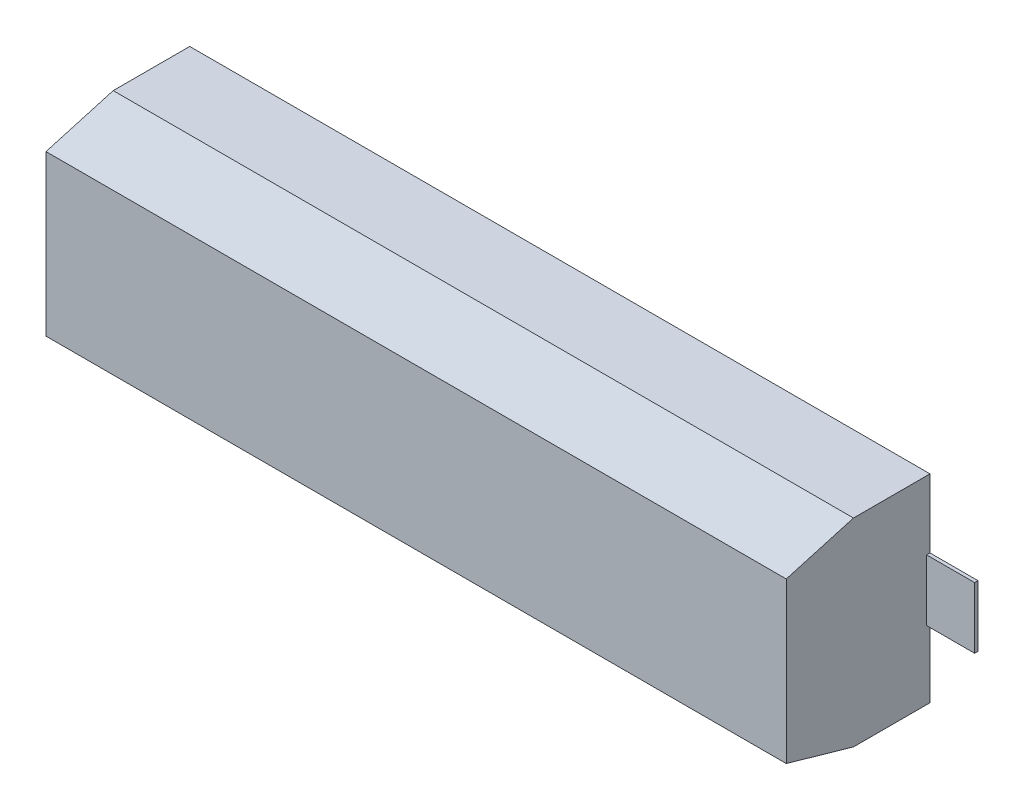
ISO-10303-21;
HEADER;
FILE_DESCRIPTION(('STEP AP214'),'2;1');
FILE_NAME('part.step','',(''),(''),'','','');
FILE_SCHEMA(('AUTOMOTIVE_DESIGN { 1 0 10303 214 1 1 1 1 }'));
ENDSEC;
DATA;
#1=APPLICATION_CONTEXT('core data for automotive mechanical design processes');
#2=APPLICATION_PROTOCOL_DEFINITION('international standard','automotive_design',2000,#1);
#3=PRODUCT_CONTEXT('',#1,'mechanical');
#4=PRODUCT('Part','Part','',(#3));
#5=PRODUCT_RELATED_PRODUCT_CATEGORY('part','',(#4));
#6=PRODUCT_DEFINITION_FORMATION('','',#4);
#7=PRODUCT_DEFINITION_CONTEXT('part definition',#1,'design');
#8=PRODUCT_DEFINITION('design','',#6,#7);
#9=PRODUCT_DEFINITION_SHAPE('','',#8);
#10=(LENGTH_UNIT() NAMED_UNIT(*) SI_UNIT(.MILLI.,.METRE.));
#11=(NAMED_UNIT(*) PLANE_ANGLE_UNIT() SI_UNIT($,.RADIAN.));
#12=(NAMED_UNIT(*) SI_UNIT($,.STERADIAN.) SOLID_ANGLE_UNIT());
#13=UNCERTAINTY_MEASURE_WITH_UNIT(LENGTH_MEASURE(1.E-05),#10,'distance_accuracy_value','');
#14=(GEOMETRIC_REPRESENTATION_CONTEXT(3) GLOBAL_UNCERTAINTY_ASSIGNED_CONTEXT((#13)) GLOBAL_UNIT_ASSIGNED_CONTEXT((#10,
#11,#12)) REPRESENTATION_CONTEXT('',''));
#15=CARTESIAN_POINT('',(0.,0.,0.));
#16=DIRECTION('',(0.,0.,1.));
#17=DIRECTION('',(1.,0.,0.));
#18=AXIS2_PLACEMENT_3D('',#15,#16,#17);
#19=CARTESIAN_POINT('',(38.555,10.325,14.97));
#20=DIRECTION('',(-1.,0.,0.));
#21=DIRECTION('',(0.,-1.,0.));
#22=AXIS2_PLACEMENT_3D('',#19,#20,#21);
#23=PLANE('',#22);
#24=DIRECTION('',(0.,0.,-1.));
#25=VECTOR('',#24,1.);
#26=CARTESIAN_POINT('',(38.555,-3.19,0.35));
#27=LINE('',#26,#25);
#28=CARTESIAN_POINT('',(38.555,-3.19,0.35));
#29=VERTEX_POINT('',#28);
#30=CARTESIAN_POINT('',(38.555,-3.19,0.));
#31=VERTEX_POINT('',#30);
#32=EDGE_CURVE('E170',#29,#31,#27,.T.);
#33=ORIENTED_EDGE('',*,*,#32,.F.);
#34=DIRECTION('',(0.,1.,0.));
#35=VECTOR('',#34,1.);
#36=CARTESIAN_POINT('',(38.555,3.19,0.35));
#37=LINE('',#36,#35);
#38=CARTESIAN_POINT('',(38.555,3.19,0.35));
#39=VERTEX_POINT('',#38);
#40=EDGE_CURVE('E162',#29,#39,#37,.T.);
#41=ORIENTED_EDGE('',*,*,#40,.T.);
#42=DIRECTION('',(0.,0.,-1.));
#43=VECTOR('',#42,1.);
#44=CARTESIAN_POINT('',(38.555,3.19,0.35));
#45=LINE('',#44,#43);
#46=CARTESIAN_POINT('',(38.555,3.19,0.));
#47=VERTEX_POINT('',#46);
#48=EDGE_CURVE('E147',#39,#47,#45,.T.);
#49=ORIENTED_EDGE('',*,*,#48,.T.);
#50=DIRECTION('',(0.,1.,0.));
#51=VECTOR('',#50,1.);
#52=CARTESIAN_POINT('',(38.555,10.325,0.));
#53=LINE('',#52,#51);
#54=CARTESIAN_POINT('',(38.555,10.325,0.));
#55=VERTEX_POINT('',#54);
#56=EDGE_CURVE('E190',#47,#55,#53,.T.);
#57=ORIENTED_EDGE('',*,*,#56,.T.);
#58=DIRECTION('',(0.,0.,-1.));
#59=VECTOR('',#58,1.);
#60=CARTESIAN_POINT('',(38.555,10.325,14.97));
#61=LINE('',#60,#59);
#62=CARTESIAN_POINT('',(38.555,10.325,7.96999999999994));
#63=VERTEX_POINT('',#62);
#64=EDGE_CURVE('E268',#63,#55,#61,.T.);
#65=ORIENTED_EDGE('',*,*,#64,.F.);
#66=DIRECTION('',(0.,-0.274721127897375,0.961523947640824));
#67=VECTOR('',#66,1.);
#68=CARTESIAN_POINT('',(38.555,8.32499999999999,14.97));
#69=LINE('',#68,#67);
#70=CARTESIAN_POINT('',(38.555,8.325,14.97));
#71=VERTEX_POINT('',#70);
#72=EDGE_CURVE('E280',#63,#71,#69,.T.);
#73=ORIENTED_EDGE('',*,*,#72,.T.);
#74=DIRECTION('',(0.,1.,0.));
#75=VECTOR('',#74,1.);
#76=CARTESIAN_POINT('',(38.555,10.325,14.97));
#77=LINE('',#76,#75);
#78=CARTESIAN_POINT('',(38.555,-8.32500000000001,14.97));
#79=VERTEX_POINT('',#78);
#80=EDGE_CURVE('E234',#79,#71,#77,.T.);
#81=ORIENTED_EDGE('',*,*,#80,.F.);
#82=DIRECTION('',(0.,-0.274721127897375,-0.961523947640824));
#83=VECTOR('',#82,1.);
#84=CARTESIAN_POINT('',(38.555,-8.32500000000001,14.97));
#85=LINE('',#84,#83);
#86=CARTESIAN_POINT('',(38.555,-10.325,7.96999999999994));
#87=VERTEX_POINT('',#86);
#88=EDGE_CURVE('E283',#79,#87,#85,.T.);
#89=ORIENTED_EDGE('',*,*,#88,.T.);
#90=DIRECTION('',(0.,0.,-1.));
#91=VECTOR('',#90,1.);
#92=CARTESIAN_POINT('',(38.555,-10.325,14.97));
#93=LINE('',#92,#91);
#94=CARTESIAN_POINT('',(38.555,-10.325,0.));
#95=VERTEX_POINT('',#94);
#96=EDGE_CURVE('E243',#87,#95,#93,.T.);
#97=ORIENTED_EDGE('',*,*,#96,.T.);
#98=EDGE_CURVE('E244',#95,#31,#53,.T.);
#99=ORIENTED_EDGE('',*,*,#98,.T.);
#100=EDGE_LOOP('',(#33,#41,#49,#57,#65,#73,#81,#89,#97,#99));
#101=FACE_BOUND('',#100,.T.);
#102=ADVANCED_FACE('F47',(#101),#23,.F.);
#103=CARTESIAN_POINT('',(-38.555,10.325,14.97));
#104=DIRECTION('',(1.,0.,0.));
#105=DIRECTION('',(0.,0.,-1.));
#106=AXIS2_PLACEMENT_3D('',#103,#104,#105);
#107=PLANE('',#106);
#108=DIRECTION('',(0.,0.,-1.));
#109=VECTOR('',#108,1.);
#110=CARTESIAN_POINT('',(-38.555,3.19,0.35));
#111=LINE('',#110,#109);
#112=CARTESIAN_POINT('',(-38.555,3.19,0.35));
#113=VERTEX_POINT('',#112);
#114=CARTESIAN_POINT('',(-38.555,3.19,0.));
#115=VERTEX_POINT('',#114);
#116=EDGE_CURVE('E206',#113,#115,#111,.T.);
#117=ORIENTED_EDGE('',*,*,#116,.F.);
#118=DIRECTION('',(0.,-1.,0.));
#119=VECTOR('',#118,1.);
#120=CARTESIAN_POINT('',(-38.555,3.19,0.35));
#121=LINE('',#120,#119);
#122=CARTESIAN_POINT('',(-38.555,-3.19,0.35));
#123=VERTEX_POINT('',#122);
#124=EDGE_CURVE('E214',#113,#123,#121,.T.);
#125=ORIENTED_EDGE('',*,*,#124,.T.);
#126=DIRECTION('',(0.,0.,-1.));
#127=VECTOR('',#126,1.);
#128=CARTESIAN_POINT('',(-38.555,-3.19,0.35));
#129=LINE('',#128,#127);
#130=CARTESIAN_POINT('',(-38.555,-3.19,0.));
#131=VERTEX_POINT('',#130);
#132=EDGE_CURVE('E196',#123,#131,#129,.T.);
#133=ORIENTED_EDGE('',*,*,#132,.T.);
#134=DIRECTION('',(0.,-1.,0.));
#135=VECTOR('',#134,1.);
#136=CARTESIAN_POINT('',(-38.555,10.325,0.));
#137=LINE('',#136,#135);
#138=CARTESIAN_POINT('',(-38.555,-10.325,0.));
#139=VERTEX_POINT('',#138);
#140=EDGE_CURVE('E251',#131,#139,#137,.T.);
#141=ORIENTED_EDGE('',*,*,#140,.T.);
#142=DIRECTION('',(0.,0.,-1.));
#143=VECTOR('',#142,1.);
#144=CARTESIAN_POINT('',(-38.555,-10.325,14.97));
#145=LINE('',#144,#143);
#146=CARTESIAN_POINT('',(-38.555,-10.325,7.96999999999994));
#147=VERTEX_POINT('',#146);
#148=EDGE_CURVE('E261',#147,#139,#145,.T.);
#149=ORIENTED_EDGE('',*,*,#148,.F.);
#150=DIRECTION('',(0.,0.274721127897375,0.961523947640824));
#151=VECTOR('',#150,1.);
#152=CARTESIAN_POINT('',(-38.555,-8.32500000000001,14.97));
#153=LINE('',#152,#151);
#154=CARTESIAN_POINT('',(-38.555,-8.32500000000001,14.97));
#155=VERTEX_POINT('',#154);
#156=EDGE_CURVE('E57',#147,#155,#153,.T.);
#157=ORIENTED_EDGE('',*,*,#156,.T.);
#158=DIRECTION('',(0.,-1.,0.));
#159=VECTOR('',#158,1.);
#160=CARTESIAN_POINT('',(-38.555,10.325,14.97));
#161=LINE('',#160,#159);
#162=CARTESIAN_POINT('',(-38.555,8.325,14.97));
#163=VERTEX_POINT('',#162);
#164=EDGE_CURVE('E238',#163,#155,#161,.T.);
#165=ORIENTED_EDGE('',*,*,#164,.F.);
#166=DIRECTION('',(0.,0.274721127897375,-0.961523947640824));
#167=VECTOR('',#166,1.);
#168=CARTESIAN_POINT('',(-38.555,8.325,14.97));
#169=LINE('',#168,#167);
#170=CARTESIAN_POINT('',(-38.555,10.325,7.96999999999994));
#171=VERTEX_POINT('',#170);
#172=EDGE_CURVE('E289',#163,#171,#169,.T.);
#173=ORIENTED_EDGE('',*,*,#172,.T.);
#174=DIRECTION('',(0.,0.,-1.));
#175=VECTOR('',#174,1.);
#176=CARTESIAN_POINT('',(-38.555,10.325,14.97));
#177=LINE('',#176,#175);
#178=CARTESIAN_POINT('',(-38.555,10.325,0.));
#179=VERTEX_POINT('',#178);
#180=EDGE_CURVE('E265',#171,#179,#177,.T.);
#181=ORIENTED_EDGE('',*,*,#180,.T.);
#182=EDGE_CURVE('E252',#179,#115,#137,.T.);
#183=ORIENTED_EDGE('',*,*,#182,.T.);
#184=EDGE_LOOP('',(#117,#125,#133,#141,#149,#157,#165,#173,#181,#183));
#185=FACE_BOUND('',#184,.T.);
#186=ADVANCED_FACE('F297',(#185),#107,.F.);
#187=CARTESIAN_POINT('',(-38.555,10.325,14.97));
#188=DIRECTION('',(0.,-1.,0.));
#189=DIRECTION('',(0.,0.,-1.));
#190=AXIS2_PLACEMENT_3D('',#187,#188,#189);
#191=PLANE('',#190);
#192=ORIENTED_EDGE('',*,*,#180,.F.);
#193=DIRECTION('',(1.,0.,0.));
#194=VECTOR('',#193,1.);
#195=CARTESIAN_POINT('',(38.555,10.325,7.96999999999994));
#196=LINE('',#195,#194);
#197=EDGE_CURVE('E11',#171,#63,#196,.T.);
#198=ORIENTED_EDGE('',*,*,#197,.T.);
#199=ORIENTED_EDGE('',*,*,#64,.T.);
#200=DIRECTION('',(-1.,0.,0.));
#201=VECTOR('',#200,1.);
#202=CARTESIAN_POINT('',(-38.555,10.325,0.));
#203=LINE('',#202,#201);
#204=EDGE_CURVE('E247',#55,#179,#203,.T.);
#205=ORIENTED_EDGE('',*,*,#204,.T.);
#206=EDGE_LOOP('',(#192,#198,#199,#205));
#207=FACE_BOUND('',#206,.T.);
#208=ADVANCED_FACE('F334',(#207),#191,.F.);
#209=CARTESIAN_POINT('',(-38.555,-10.325,14.97));
#210=DIRECTION('',(0.,1.,0.));
#211=DIRECTION('',(0.,0.,1.));
#212=AXIS2_PLACEMENT_3D('',#209,#210,#211);
#213=PLANE('',#212);
#214=ORIENTED_EDGE('',*,*,#96,.F.);
#215=DIRECTION('',(-1.,0.,0.));
#216=VECTOR('',#215,1.);
#217=CARTESIAN_POINT('',(-38.555,-10.325,7.96999999999994));
#218=LINE('',#217,#216);
#219=EDGE_CURVE('E286',#87,#147,#218,.T.);
#220=ORIENTED_EDGE('',*,*,#219,.T.);
#221=ORIENTED_EDGE('',*,*,#148,.T.);
#222=DIRECTION('',(1.,0.,0.));
#223=VECTOR('',#222,1.);
#224=CARTESIAN_POINT('',(-38.555,-10.325,0.));
#225=LINE('',#224,#223);
#226=EDGE_CURVE('E239',#139,#95,#225,.T.);
#227=ORIENTED_EDGE('',*,*,#226,.T.);
#228=EDGE_LOOP('',(#214,#220,#221,#227));
#229=FACE_BOUND('',#228,.T.);
#230=ADVANCED_FACE('F308',(#229),#213,.F.);
#231=CARTESIAN_POINT('',(0.,0.,14.97));
#232=DIRECTION('',(0.,0.,1.));
#233=DIRECTION('',(1.,0.,0.));
#234=AXIS2_PLACEMENT_3D('',#231,#232,#233);
#235=PLANE('',#234);
#236=ORIENTED_EDGE('',*,*,#164,.T.);
#237=DIRECTION('',(1.,0.,0.));
#238=VECTOR('',#237,1.);
#239=CARTESIAN_POINT('',(38.555,-8.32500000000001,14.97));
#240=LINE('',#239,#238);
#241=EDGE_CURVE('E276',#155,#79,#240,.T.);
#242=ORIENTED_EDGE('',*,*,#241,.T.);
#243=ORIENTED_EDGE('',*,*,#80,.T.);
#244=DIRECTION('',(-1.,0.,0.));
#245=VECTOR('',#244,1.);
#246=CARTESIAN_POINT('',(-38.555,8.325,14.97));
#247=LINE('',#246,#245);
#248=EDGE_CURVE('E272',#71,#163,#247,.T.);
#249=ORIENTED_EDGE('',*,*,#248,.T.);
#250=EDGE_LOOP('',(#236,#242,#243,#249));
#251=FACE_BOUND('',#250,.T.);
#252=ADVANCED_FACE('F302',(#251),#235,.T.);
#253=CARTESIAN_POINT('',(0.,0.,0.));
#254=DIRECTION('',(0.,0.,1.));
#255=DIRECTION('',(1.,0.,0.));
#256=AXIS2_PLACEMENT_3D('',#253,#254,#255);
#257=PLANE('',#256);
#258=ORIENTED_EDGE('',*,*,#98,.F.);
#259=ORIENTED_EDGE('',*,*,#226,.F.);
#260=ORIENTED_EDGE('',*,*,#140,.F.);
#261=DIRECTION('',(-1.,0.,0.));
#262=VECTOR('',#261,1.);
#263=CARTESIAN_POINT('',(-38.555,-3.19,0.));
#264=LINE('',#263,#262);
#265=CARTESIAN_POINT('',(-43.555,-3.19,0.));
#266=VERTEX_POINT('',#265);
#267=EDGE_CURVE('E72',#131,#266,#264,.T.);
#268=ORIENTED_EDGE('',*,*,#267,.T.);
#269=DIRECTION('',(0.,1.,0.));
#270=VECTOR('',#269,1.);
#271=CARTESIAN_POINT('',(-43.555,3.19,0.));
#272=LINE('',#271,#270);
#273=CARTESIAN_POINT('',(-43.555,3.19,0.));
#274=VERTEX_POINT('',#273);
#275=EDGE_CURVE('E213',#266,#274,#272,.T.);
#276=ORIENTED_EDGE('',*,*,#275,.T.);
#277=DIRECTION('',(1.,0.,0.));
#278=VECTOR('',#277,1.);
#279=CARTESIAN_POINT('',(-38.555,3.19,0.));
#280=LINE('',#279,#278);
#281=EDGE_CURVE('E209',#274,#115,#280,.T.);
#282=ORIENTED_EDGE('',*,*,#281,.T.);
#283=ORIENTED_EDGE('',*,*,#182,.F.);
#284=ORIENTED_EDGE('',*,*,#204,.F.);
#285=ORIENTED_EDGE('',*,*,#56,.F.);
#286=DIRECTION('',(1.,0.,0.));
#287=VECTOR('',#286,1.);
#288=CARTESIAN_POINT('',(38.555,3.19,0.));
#289=LINE('',#288,#287);
#290=CARTESIAN_POINT('',(43.555,3.19,0.));
#291=VERTEX_POINT('',#290);
#292=EDGE_CURVE('E64',#47,#291,#289,.T.);
#293=ORIENTED_EDGE('',*,*,#292,.T.);
#294=DIRECTION('',(0.,-1.,0.));
#295=VECTOR('',#294,1.);
#296=CARTESIAN_POINT('',(43.555,3.19,0.));
#297=LINE('',#296,#295);
#298=CARTESIAN_POINT('',(43.555,-3.19,0.));
#299=VERTEX_POINT('',#298);
#300=EDGE_CURVE('E176',#291,#299,#297,.T.);
#301=ORIENTED_EDGE('',*,*,#300,.T.);
#302=DIRECTION('',(-1.,0.,0.));
#303=VECTOR('',#302,1.);
#304=CARTESIAN_POINT('',(38.555,-3.19,0.));
#305=LINE('',#304,#303);
#306=EDGE_CURVE('E172',#299,#31,#305,.T.);
#307=ORIENTED_EDGE('',*,*,#306,.T.);
#308=EDGE_LOOP('',(#258,#259,#260,#268,#276,#282,#283,#284,#285,#293,#301,#307));
#309=FACE_BOUND('',#308,.T.);
#310=ADVANCED_FACE('F313',(#309),#257,.F.);
#311=CARTESIAN_POINT('',(0.,-8.32500000000001,14.97));
#312=DIRECTION('',(0.,-0.961523947640824,0.274721127897375));
#313=DIRECTION('',(-1.,0.,0.));
#314=AXIS2_PLACEMENT_3D('',#311,#312,#313);
#315=PLANE('',#314);
#316=ORIENTED_EDGE('',*,*,#156,.F.);
#317=ORIENTED_EDGE('',*,*,#219,.F.);
#318=ORIENTED_EDGE('',*,*,#88,.F.);
#319=ORIENTED_EDGE('',*,*,#241,.F.);
#320=EDGE_LOOP('',(#316,#317,#318,#319));
#321=FACE_BOUND('',#320,.T.);
#322=ADVANCED_FACE('F305',(#321),#315,.T.);
#323=CARTESIAN_POINT('',(0.,8.325,14.97));
#324=DIRECTION('',(0.,0.961523947640824,0.274721127897375));
#325=DIRECTION('',(1.,0.,0.));
#326=AXIS2_PLACEMENT_3D('',#323,#324,#325);
#327=PLANE('',#326);
#328=ORIENTED_EDGE('',*,*,#72,.F.);
#329=ORIENTED_EDGE('',*,*,#197,.F.);
#330=ORIENTED_EDGE('',*,*,#172,.F.);
#331=ORIENTED_EDGE('',*,*,#248,.F.);
#332=EDGE_LOOP('',(#328,#329,#330,#331));
#333=FACE_BOUND('',#332,.T.);
#334=ADVANCED_FACE('F50',(#333),#327,.T.);
#335=CARTESIAN_POINT('',(-38.555,3.19,0.35));
#336=DIRECTION('',(0.,1.,0.));
#337=DIRECTION('',(-1.,0.,0.));
#338=AXIS2_PLACEMENT_3D('',#335,#336,#337);
#339=PLANE('',#338);
#340=ORIENTED_EDGE('',*,*,#281,.F.);
#341=DIRECTION('',(0.,0.,-1.));
#342=VECTOR('',#341,1.);
#343=CARTESIAN_POINT('',(-43.555,3.19,0.35));
#344=LINE('',#343,#342);
#345=CARTESIAN_POINT('',(-43.555,3.19,0.35));
#346=VERTEX_POINT('',#345);
#347=EDGE_CURVE('E203',#346,#274,#344,.T.);
#348=ORIENTED_EDGE('',*,*,#347,.F.);
#349=DIRECTION('',(1.,0.,0.));
#350=VECTOR('',#349,1.);
#351=CARTESIAN_POINT('',(-38.555,3.19,0.35));
#352=LINE('',#351,#350);
#353=EDGE_CURVE('E199',#346,#113,#352,.T.);
#354=ORIENTED_EDGE('',*,*,#353,.T.);
#355=ORIENTED_EDGE('',*,*,#116,.T.);
#356=EDGE_LOOP('',(#340,#348,#354,#355));
#357=FACE_BOUND('',#356,.T.);
#358=ADVANCED_FACE('F329',(#357),#339,.T.);
#359=CARTESIAN_POINT('',(-43.555,3.19,0.35));
#360=DIRECTION('',(-1.,0.,0.));
#361=DIRECTION('',(0.,0.,1.));
#362=AXIS2_PLACEMENT_3D('',#359,#360,#361);
#363=PLANE('',#362);
#364=ORIENTED_EDGE('',*,*,#275,.F.);
#365=DIRECTION('',(0.,0.,-1.));
#366=VECTOR('',#365,1.);
#367=CARTESIAN_POINT('',(-43.555,-3.19,0.35));
#368=LINE('',#367,#366);
#369=CARTESIAN_POINT('',(-43.555,-3.19,0.35));
#370=VERTEX_POINT('',#369);
#371=EDGE_CURVE('E200',#370,#266,#368,.T.);
#372=ORIENTED_EDGE('',*,*,#371,.F.);
#373=DIRECTION('',(0.,1.,0.));
#374=VECTOR('',#373,1.);
#375=CARTESIAN_POINT('',(-43.555,3.19,0.35));
#376=LINE('',#375,#374);
#377=EDGE_CURVE('E223',#370,#346,#376,.T.);
#378=ORIENTED_EDGE('',*,*,#377,.T.);
#379=ORIENTED_EDGE('',*,*,#347,.T.);
#380=EDGE_LOOP('',(#364,#372,#378,#379));
#381=FACE_BOUND('',#380,.T.);
#382=ADVANCED_FACE('F343',(#381),#363,.T.);
#383=CARTESIAN_POINT('',(-38.555,-3.19,0.35));
#384=DIRECTION('',(0.,-1.,0.));
#385=DIRECTION('',(1.,0.,0.));
#386=AXIS2_PLACEMENT_3D('',#383,#384,#385);
#387=PLANE('',#386);
#388=ORIENTED_EDGE('',*,*,#267,.F.);
#389=ORIENTED_EDGE('',*,*,#132,.F.);
#390=DIRECTION('',(-1.,0.,0.));
#391=VECTOR('',#390,1.);
#392=CARTESIAN_POINT('',(-38.555,-3.19,0.35));
#393=LINE('',#392,#391);
#394=EDGE_CURVE('E227',#123,#370,#393,.T.);
#395=ORIENTED_EDGE('',*,*,#394,.T.);
#396=ORIENTED_EDGE('',*,*,#371,.T.);
#397=EDGE_LOOP('',(#388,#389,#395,#396));
#398=FACE_BOUND('',#397,.T.);
#399=ADVANCED_FACE('F366',(#398),#387,.T.);
#400=CARTESIAN_POINT('',(0.,0.,0.35));
#401=DIRECTION('',(0.,0.,-1.));
#402=DIRECTION('',(-1.,0.,0.));
#403=AXIS2_PLACEMENT_3D('',#400,#401,#402);
#404=PLANE('',#403);
#405=ORIENTED_EDGE('',*,*,#124,.F.);
#406=ORIENTED_EDGE('',*,*,#353,.F.);
#407=ORIENTED_EDGE('',*,*,#377,.F.);
#408=ORIENTED_EDGE('',*,*,#394,.F.);
#409=EDGE_LOOP('',(#405,#406,#407,#408));
#410=FACE_BOUND('',#409,.T.);
#411=ADVANCED_FACE('F364',(#410),#404,.F.);
#412=CARTESIAN_POINT('',(38.555,-3.19,0.35));
#413=DIRECTION('',(0.,-1.,0.));
#414=DIRECTION('',(1.,0.,0.));
#415=AXIS2_PLACEMENT_3D('',#412,#413,#414);
#416=PLANE('',#415);
#417=ORIENTED_EDGE('',*,*,#306,.F.);
#418=DIRECTION('',(0.,0.,-1.));
#419=VECTOR('',#418,1.);
#420=CARTESIAN_POINT('',(43.555,-3.19,0.35));
#421=LINE('',#420,#419);
#422=CARTESIAN_POINT('',(43.555,-3.19,0.35));
#423=VERTEX_POINT('',#422);
#424=EDGE_CURVE('E191',#423,#299,#421,.T.);
#425=ORIENTED_EDGE('',*,*,#424,.F.);
#426=DIRECTION('',(-1.,0.,0.));
#427=VECTOR('',#426,1.);
#428=CARTESIAN_POINT('',(38.555,-3.19,0.35));
#429=LINE('',#428,#427);
#430=EDGE_CURVE('E156',#423,#29,#429,.T.);
#431=ORIENTED_EDGE('',*,*,#430,.T.);
#432=ORIENTED_EDGE('',*,*,#32,.T.);
#433=EDGE_LOOP('',(#417,#425,#431,#432));
#434=FACE_BOUND('',#433,.T.);
#435=ADVANCED_FACE('F317',(#434),#416,.T.);
#436=CARTESIAN_POINT('',(43.555,3.19,0.35));
#437=DIRECTION('',(1.,0.,0.));
#438=DIRECTION('',(0.,0.,-1.));
#439=AXIS2_PLACEMENT_3D('',#436,#437,#438);
#440=PLANE('',#439);
#441=ORIENTED_EDGE('',*,*,#300,.F.);
#442=DIRECTION('',(0.,0.,-1.));
#443=VECTOR('',#442,1.);
#444=CARTESIAN_POINT('',(43.555,3.19,0.35));
#445=LINE('',#444,#443);
#446=CARTESIAN_POINT('',(43.555,3.19,0.35));
#447=VERTEX_POINT('',#446);
#448=EDGE_CURVE('E155',#447,#291,#445,.T.);
#449=ORIENTED_EDGE('',*,*,#448,.F.);
#450=DIRECTION('',(0.,-1.,0.));
#451=VECTOR('',#450,1.);
#452=CARTESIAN_POINT('',(43.555,3.19,0.35));
#453=LINE('',#452,#451);
#454=EDGE_CURVE('E165',#447,#423,#453,.T.);
#455=ORIENTED_EDGE('',*,*,#454,.T.);
#456=ORIENTED_EDGE('',*,*,#424,.T.);
#457=EDGE_LOOP('',(#441,#449,#455,#456));
#458=FACE_BOUND('',#457,.T.);
#459=ADVANCED_FACE('F319',(#458),#440,.T.);
#460=CARTESIAN_POINT('',(38.555,3.19,0.35));
#461=DIRECTION('',(0.,1.,0.));
#462=DIRECTION('',(-1.,0.,0.));
#463=AXIS2_PLACEMENT_3D('',#460,#461,#462);
#464=PLANE('',#463);
#465=ORIENTED_EDGE('',*,*,#292,.F.);
#466=ORIENTED_EDGE('',*,*,#48,.F.);
#467=DIRECTION('',(1.,0.,0.));
#468=VECTOR('',#467,1.);
#469=CARTESIAN_POINT('',(38.555,3.19,0.35));
#470=LINE('',#469,#468);
#471=EDGE_CURVE('E150',#39,#447,#470,.T.);
#472=ORIENTED_EDGE('',*,*,#471,.T.);
#473=ORIENTED_EDGE('',*,*,#448,.T.);
#474=EDGE_LOOP('',(#465,#466,#472,#473));
#475=FACE_BOUND('',#474,.T.);
#476=ADVANCED_FACE('F149',(#475),#464,.T.);
#477=CARTESIAN_POINT('',(0.,0.,0.35));
#478=DIRECTION('',(0.,0.,1.));
#479=DIRECTION('',(1.,0.,0.));
#480=AXIS2_PLACEMENT_3D('',#477,#478,#479);
#481=PLANE('',#480);
#482=ORIENTED_EDGE('',*,*,#40,.F.);
#483=ORIENTED_EDGE('',*,*,#430,.F.);
#484=ORIENTED_EDGE('',*,*,#454,.F.);
#485=ORIENTED_EDGE('',*,*,#471,.F.);
#486=EDGE_LOOP('',(#482,#483,#484,#485));
#487=FACE_BOUND('',#486,.T.);
#488=ADVANCED_FACE('F160',(#487),#481,.T.);
#489=CLOSED_SHELL('',(#102,#186,#208,#230,#252,#310,#322,#334,#358,#382,#399,#411,#435,#459,
#476,#488));
#490=MANIFOLD_SOLID_BREP('B2',#489);
#491=ADVANCED_BREP_SHAPE_REPRESENTATION('',(#18,#490),#14);
#492=SHAPE_DEFINITION_REPRESENTATION(#9,#491);
ENDSEC;
END-ISO-10303-21;
